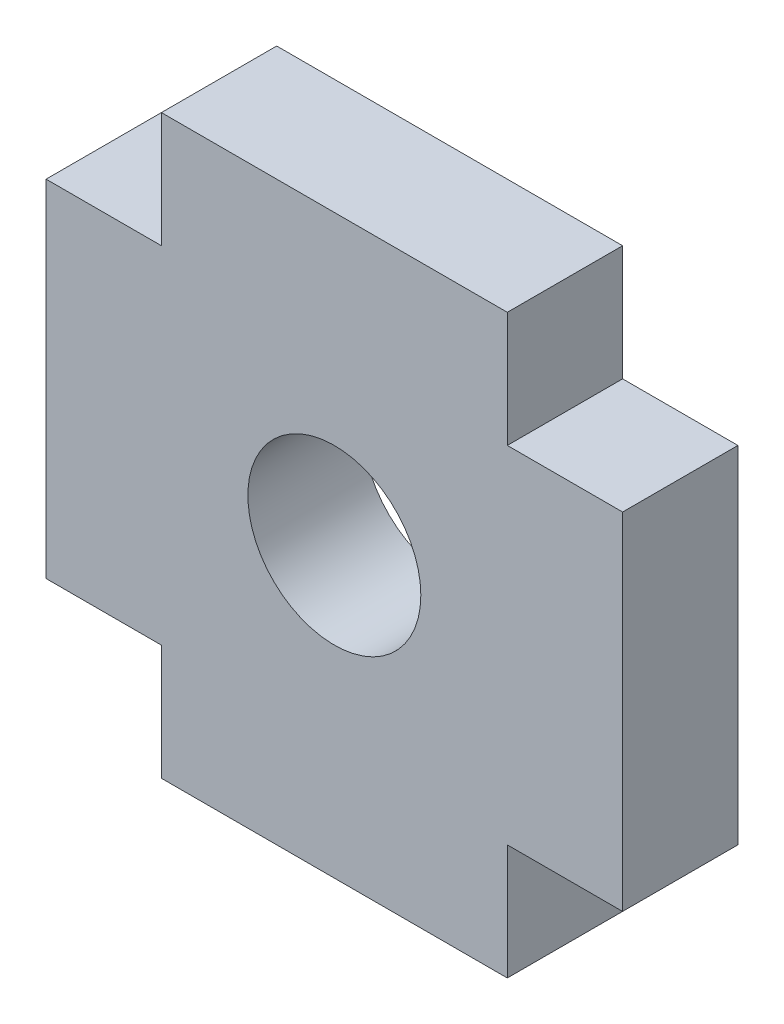
ISO-10303-21;
HEADER;
FILE_DESCRIPTION(('STEP AP214'),'2;1');
FILE_NAME('part.step','',(''),(''),'','','');
FILE_SCHEMA(('AUTOMOTIVE_DESIGN { 1 0 10303 214 1 1 1 1 }'));
ENDSEC;
DATA;
#1=APPLICATION_CONTEXT('core data for automotive mechanical design processes');
#2=APPLICATION_PROTOCOL_DEFINITION('international standard','automotive_design',2000,#1);
#3=PRODUCT_CONTEXT('',#1,'mechanical');
#4=PRODUCT('Part','Part','',(#3));
#5=PRODUCT_RELATED_PRODUCT_CATEGORY('part','',(#4));
#6=PRODUCT_DEFINITION_FORMATION('','',#4);
#7=PRODUCT_DEFINITION_CONTEXT('part definition',#1,'design');
#8=PRODUCT_DEFINITION('design','',#6,#7);
#9=PRODUCT_DEFINITION_SHAPE('','',#8);
#10=(LENGTH_UNIT() NAMED_UNIT(*) SI_UNIT(.MILLI.,.METRE.));
#11=(NAMED_UNIT(*) PLANE_ANGLE_UNIT() SI_UNIT($,.RADIAN.));
#12=(NAMED_UNIT(*) SI_UNIT($,.STERADIAN.) SOLID_ANGLE_UNIT());
#13=UNCERTAINTY_MEASURE_WITH_UNIT(LENGTH_MEASURE(1.E-05),#10,'distance_accuracy_value','');
#14=(GEOMETRIC_REPRESENTATION_CONTEXT(3) GLOBAL_UNCERTAINTY_ASSIGNED_CONTEXT((#13)) GLOBAL_UNIT_ASSIGNED_CONTEXT((#10,
#11,#12)) REPRESENTATION_CONTEXT('',''));
#15=CARTESIAN_POINT('',(0.,0.,0.));
#16=DIRECTION('',(0.,0.,1.));
#17=DIRECTION('',(1.,0.,0.));
#18=AXIS2_PLACEMENT_3D('',#15,#16,#17);
#19=CARTESIAN_POINT('',(0.,0.,2.));
#20=DIRECTION('',(0.,0.,1.));
#21=DIRECTION('',(1.,0.,0.));
#22=AXIS2_PLACEMENT_3D('',#19,#20,#21);
#23=PLANE('',#22);
#24=DIRECTION('',(0.,-1.,0.));
#25=VECTOR('',#24,1.);
#26=CARTESIAN_POINT('',(2078.67595263579,1296.22347890105,2.));
#27=LINE('',#26,#25);
#28=CARTESIAN_POINT('',(2078.67595263579,1296.22347890105,2.));
#29=VERTEX_POINT('',#28);
#30=CARTESIAN_POINT('',(2078.67595263579,1290.22347890105,2.));
#31=VERTEX_POINT('',#30);
#32=EDGE_CURVE('E178',#29,#31,#27,.T.);
#33=ORIENTED_EDGE('',*,*,#32,.T.);
#34=DIRECTION('',(1.,0.,0.));
#35=VECTOR('',#34,1.);
#36=CARTESIAN_POINT('',(2078.67595263579,1290.22347890105,2.));
#37=LINE('',#36,#35);
#38=CARTESIAN_POINT('',(2080.67595263579,1290.22347890105,2.));
#39=VERTEX_POINT('',#38);
#40=EDGE_CURVE('E106',#31,#39,#37,.T.);
#41=ORIENTED_EDGE('',*,*,#40,.T.);
#42=DIRECTION('',(0.,-1.,0.));
#43=VECTOR('',#42,1.);
#44=CARTESIAN_POINT('',(2080.67595263579,1290.22347890105,2.));
#45=LINE('',#44,#43);
#46=CARTESIAN_POINT('',(2080.67595263579,1288.22347890105,2.));
#47=VERTEX_POINT('',#46);
#48=EDGE_CURVE('E205',#39,#47,#45,.T.);
#49=ORIENTED_EDGE('',*,*,#48,.T.);
#50=DIRECTION('',(1.,0.,0.));
#51=VECTOR('',#50,1.);
#52=CARTESIAN_POINT('',(2080.67595263579,1288.22347890105,2.));
#53=LINE('',#52,#51);
#54=CARTESIAN_POINT('',(2086.67595263579,1288.22347890105,2.));
#55=VERTEX_POINT('',#54);
#56=EDGE_CURVE('E224',#47,#55,#53,.T.);
#57=ORIENTED_EDGE('',*,*,#56,.T.);
#58=DIRECTION('',(0.,1.,0.));
#59=VECTOR('',#58,1.);
#60=CARTESIAN_POINT('',(2086.67595263579,1288.22347890105,2.));
#61=LINE('',#60,#59);
#62=CARTESIAN_POINT('',(2086.67595263579,1290.22347890105,2.));
#63=VERTEX_POINT('',#62);
#64=EDGE_CURVE('E221',#55,#63,#61,.T.);
#65=ORIENTED_EDGE('',*,*,#64,.T.);
#66=DIRECTION('',(1.,0.,0.));
#67=VECTOR('',#66,1.);
#68=CARTESIAN_POINT('',(2088.67595263579,1290.22347890105,2.));
#69=LINE('',#68,#67);
#70=CARTESIAN_POINT('',(2088.67595263579,1290.22347890105,2.));
#71=VERTEX_POINT('',#70);
#72=EDGE_CURVE('E223',#63,#71,#69,.T.);
#73=ORIENTED_EDGE('',*,*,#72,.T.);
#74=DIRECTION('',(0.,1.,0.));
#75=VECTOR('',#74,1.);
#76=CARTESIAN_POINT('',(2088.67595263579,1296.22347890105,2.));
#77=LINE('',#76,#75);
#78=CARTESIAN_POINT('',(2088.67595263579,1296.22347890105,2.));
#79=VERTEX_POINT('',#78);
#80=EDGE_CURVE('E226',#71,#79,#77,.T.);
#81=ORIENTED_EDGE('',*,*,#80,.T.);
#82=DIRECTION('',(-1.,0.,0.));
#83=VECTOR('',#82,1.);
#84=CARTESIAN_POINT('',(2086.67595263579,1296.22347890105,2.));
#85=LINE('',#84,#83);
#86=CARTESIAN_POINT('',(2086.67595263579,1296.22347890105,2.));
#87=VERTEX_POINT('',#86);
#88=EDGE_CURVE('E232',#79,#87,#85,.T.);
#89=ORIENTED_EDGE('',*,*,#88,.T.);
#90=DIRECTION('',(0.,1.,0.));
#91=VECTOR('',#90,1.);
#92=CARTESIAN_POINT('',(2086.67595263579,1296.22347890105,2.));
#93=LINE('',#92,#91);
#94=CARTESIAN_POINT('',(2086.67595263579,1298.22347890105,2.));
#95=VERTEX_POINT('',#94);
#96=EDGE_CURVE('E137',#87,#95,#93,.T.);
#97=ORIENTED_EDGE('',*,*,#96,.T.);
#98=DIRECTION('',(-1.,0.,0.));
#99=VECTOR('',#98,1.);
#100=CARTESIAN_POINT('',(2086.67595263579,1298.22347890105,2.));
#101=LINE('',#100,#99);
#102=CARTESIAN_POINT('',(2080.67595263579,1298.22347890105,2.));
#103=VERTEX_POINT('',#102);
#104=EDGE_CURVE('E131',#95,#103,#101,.T.);
#105=ORIENTED_EDGE('',*,*,#104,.T.);
#106=DIRECTION('',(0.,-1.,0.));
#107=VECTOR('',#106,1.);
#108=CARTESIAN_POINT('',(2080.67595263579,1298.22347890105,2.));
#109=LINE('',#108,#107);
#110=CARTESIAN_POINT('',(2080.67595263579,1296.22347890105,2.));
#111=VERTEX_POINT('',#110);
#112=EDGE_CURVE('E135',#103,#111,#109,.T.);
#113=ORIENTED_EDGE('',*,*,#112,.T.);
#114=DIRECTION('',(-1.,0.,0.));
#115=VECTOR('',#114,1.);
#116=CARTESIAN_POINT('',(2080.67595263579,1296.22347890105,2.));
#117=LINE('',#116,#115);
#118=EDGE_CURVE('E51',#111,#29,#117,.T.);
#119=ORIENTED_EDGE('',*,*,#118,.T.);
#120=EDGE_LOOP('',(#33,#41,#49,#57,#65,#73,#81,#89,#97,#105,#113,#119));
#121=FACE_BOUND('',#120,.T.);
#122=CARTESIAN_POINT('',(2083.67595263579,1293.22347890105,2.));
#123=DIRECTION('',(0.,0.,1.));
#124=DIRECTION('',(1.,0.,0.));
#125=AXIS2_PLACEMENT_3D('',#122,#123,#124);
#126=CIRCLE('',#125,1.50000000000006);
#127=CARTESIAN_POINT('',(2085.17595263579,1293.22347890105,2.));
#128=VERTEX_POINT('',#127);
#129=EDGE_CURVE('E159',#128,#128,#126,.T.);
#130=ORIENTED_EDGE('',*,*,#129,.F.);
#131=EDGE_LOOP('',(#130));
#132=FACE_BOUND('',#131,.T.);
#133=ADVANCED_FACE('F34',(#121,#132),#23,.T.);
#134=CARTESIAN_POINT('',(0.,0.,0.));
#135=DIRECTION('',(0.,0.,1.));
#136=DIRECTION('',(1.,0.,0.));
#137=AXIS2_PLACEMENT_3D('',#134,#135,#136);
#138=PLANE('',#137);
#139=DIRECTION('',(0.,-1.,0.));
#140=VECTOR('',#139,1.);
#141=CARTESIAN_POINT('',(2078.67595263579,1296.22347890105,0.));
#142=LINE('',#141,#140);
#143=CARTESIAN_POINT('',(2078.67595263579,1296.22347890105,0.));
#144=VERTEX_POINT('',#143);
#145=CARTESIAN_POINT('',(2078.67595263579,1290.22347890105,0.));
#146=VERTEX_POINT('',#145);
#147=EDGE_CURVE('E155',#144,#146,#142,.T.);
#148=ORIENTED_EDGE('',*,*,#147,.F.);
#149=DIRECTION('',(-1.,0.,0.));
#150=VECTOR('',#149,1.);
#151=CARTESIAN_POINT('',(2080.67595263579,1296.22347890105,0.));
#152=LINE('',#151,#150);
#153=CARTESIAN_POINT('',(2080.67595263579,1296.22347890105,0.));
#154=VERTEX_POINT('',#153);
#155=EDGE_CURVE('E98',#154,#144,#152,.T.);
#156=ORIENTED_EDGE('',*,*,#155,.F.);
#157=DIRECTION('',(0.,-1.,0.));
#158=VECTOR('',#157,1.);
#159=CARTESIAN_POINT('',(2080.67595263579,1298.22347890105,0.));
#160=LINE('',#159,#158);
#161=CARTESIAN_POINT('',(2080.67595263579,1298.22347890105,0.));
#162=VERTEX_POINT('',#161);
#163=EDGE_CURVE('E92',#162,#154,#160,.T.);
#164=ORIENTED_EDGE('',*,*,#163,.F.);
#165=DIRECTION('',(-1.,0.,0.));
#166=VECTOR('',#165,1.);
#167=CARTESIAN_POINT('',(2086.67595263579,1298.22347890105,0.));
#168=LINE('',#167,#166);
#169=CARTESIAN_POINT('',(2086.67595263579,1298.22347890105,0.));
#170=VERTEX_POINT('',#169);
#171=EDGE_CURVE('E145',#170,#162,#168,.T.);
#172=ORIENTED_EDGE('',*,*,#171,.F.);
#173=DIRECTION('',(0.,1.,0.));
#174=VECTOR('',#173,1.);
#175=CARTESIAN_POINT('',(2086.67595263579,1296.22347890105,0.));
#176=LINE('',#175,#174);
#177=CARTESIAN_POINT('',(2086.67595263579,1296.22347890105,0.));
#178=VERTEX_POINT('',#177);
#179=EDGE_CURVE('E173',#178,#170,#176,.T.);
#180=ORIENTED_EDGE('',*,*,#179,.F.);
#181=DIRECTION('',(-1.,0.,0.));
#182=VECTOR('',#181,1.);
#183=CARTESIAN_POINT('',(2086.67595263579,1296.22347890105,0.));
#184=LINE('',#183,#182);
#185=CARTESIAN_POINT('',(2088.67595263579,1296.22347890105,0.));
#186=VERTEX_POINT('',#185);
#187=EDGE_CURVE('E171',#186,#178,#184,.T.);
#188=ORIENTED_EDGE('',*,*,#187,.F.);
#189=DIRECTION('',(0.,1.,0.));
#190=VECTOR('',#189,1.);
#191=CARTESIAN_POINT('',(2088.67595263579,1296.22347890105,0.));
#192=LINE('',#191,#190);
#193=CARTESIAN_POINT('',(2088.67595263579,1290.22347890105,0.));
#194=VERTEX_POINT('',#193);
#195=EDGE_CURVE('E169',#194,#186,#192,.T.);
#196=ORIENTED_EDGE('',*,*,#195,.F.);
#197=DIRECTION('',(1.,0.,0.));
#198=VECTOR('',#197,1.);
#199=CARTESIAN_POINT('',(2088.67595263579,1290.22347890105,0.));
#200=LINE('',#199,#198);
#201=CARTESIAN_POINT('',(2086.67595263579,1290.22347890105,0.));
#202=VERTEX_POINT('',#201);
#203=EDGE_CURVE('E167',#202,#194,#200,.T.);
#204=ORIENTED_EDGE('',*,*,#203,.F.);
#205=DIRECTION('',(0.,1.,0.));
#206=VECTOR('',#205,1.);
#207=CARTESIAN_POINT('',(2086.67595263579,1288.22347890105,0.));
#208=LINE('',#207,#206);
#209=CARTESIAN_POINT('',(2086.67595263579,1288.22347890105,0.));
#210=VERTEX_POINT('',#209);
#211=EDGE_CURVE('E165',#210,#202,#208,.T.);
#212=ORIENTED_EDGE('',*,*,#211,.F.);
#213=DIRECTION('',(1.,0.,0.));
#214=VECTOR('',#213,1.);
#215=CARTESIAN_POINT('',(2080.67595263579,1288.22347890105,0.));
#216=LINE('',#215,#214);
#217=CARTESIAN_POINT('',(2080.67595263579,1288.22347890105,0.));
#218=VERTEX_POINT('',#217);
#219=EDGE_CURVE('E163',#218,#210,#216,.T.);
#220=ORIENTED_EDGE('',*,*,#219,.F.);
#221=DIRECTION('',(0.,-1.,0.));
#222=VECTOR('',#221,1.);
#223=CARTESIAN_POINT('',(2080.67595263579,1290.22347890105,0.));
#224=LINE('',#223,#222);
#225=CARTESIAN_POINT('',(2080.67595263579,1290.22347890105,0.));
#226=VERTEX_POINT('',#225);
#227=EDGE_CURVE('E161',#226,#218,#224,.T.);
#228=ORIENTED_EDGE('',*,*,#227,.F.);
#229=DIRECTION('',(1.,0.,0.));
#230=VECTOR('',#229,1.);
#231=CARTESIAN_POINT('',(2078.67595263579,1290.22347890105,0.));
#232=LINE('',#231,#230);
#233=EDGE_CURVE('E158',#146,#226,#232,.T.);
#234=ORIENTED_EDGE('',*,*,#233,.F.);
#235=EDGE_LOOP('',(#148,#156,#164,#172,#180,#188,#196,#204,#212,#220,#228,#234));
#236=FACE_BOUND('',#235,.T.);
#237=CARTESIAN_POINT('',(2083.67595263579,1293.22347890105,0.));
#238=DIRECTION('',(0.,0.,1.));
#239=DIRECTION('',(1.,0.,0.));
#240=AXIS2_PLACEMENT_3D('',#237,#238,#239);
#241=CIRCLE('',#240,1.50000000000006);
#242=CARTESIAN_POINT('',(2085.17595263579,1293.22347890105,0.));
#243=VERTEX_POINT('',#242);
#244=EDGE_CURVE('E394',#243,#243,#241,.T.);
#245=ORIENTED_EDGE('',*,*,#244,.T.);
#246=EDGE_LOOP('',(#245));
#247=FACE_BOUND('',#246,.T.);
#248=ADVANCED_FACE('F209',(#236,#247),#138,.F.);
#249=CARTESIAN_POINT('',(2078.67595263579,1296.22347890105,2.));
#250=DIRECTION('',(1.,0.,0.));
#251=DIRECTION('',(0.,0.,-1.));
#252=AXIS2_PLACEMENT_3D('',#249,#250,#251);
#253=PLANE('',#252);
#254=ORIENTED_EDGE('',*,*,#147,.T.);
#255=DIRECTION('',(0.,0.,-1.));
#256=VECTOR('',#255,1.);
#257=CARTESIAN_POINT('',(2078.67595263579,1290.22347890105,2.));
#258=LINE('',#257,#256);
#259=EDGE_CURVE('E11',#31,#146,#258,.T.);
#260=ORIENTED_EDGE('',*,*,#259,.F.);
#261=ORIENTED_EDGE('',*,*,#32,.F.);
#262=DIRECTION('',(0.,0.,-1.));
#263=VECTOR('',#262,1.);
#264=CARTESIAN_POINT('',(2078.67595263579,1296.22347890105,2.));
#265=LINE('',#264,#263);
#266=EDGE_CURVE('E151',#29,#144,#265,.T.);
#267=ORIENTED_EDGE('',*,*,#266,.T.);
#268=EDGE_LOOP('',(#254,#260,#261,#267));
#269=FACE_BOUND('',#268,.T.);
#270=ADVANCED_FACE('F36',(#269),#253,.F.);
#271=CARTESIAN_POINT('',(2078.67595263579,1290.22347890105,2.));
#272=DIRECTION('',(0.,1.,0.));
#273=DIRECTION('',(0.,0.,1.));
#274=AXIS2_PLACEMENT_3D('',#271,#272,#273);
#275=PLANE('',#274);
#276=ORIENTED_EDGE('',*,*,#233,.T.);
#277=DIRECTION('',(0.,0.,-1.));
#278=VECTOR('',#277,1.);
#279=CARTESIAN_POINT('',(2080.67595263579,1290.22347890105,2.));
#280=LINE('',#279,#278);
#281=EDGE_CURVE('E43',#39,#226,#280,.T.);
#282=ORIENTED_EDGE('',*,*,#281,.F.);
#283=ORIENTED_EDGE('',*,*,#40,.F.);
#284=ORIENTED_EDGE('',*,*,#259,.T.);
#285=EDGE_LOOP('',(#276,#282,#283,#284));
#286=FACE_BOUND('',#285,.T.);
#287=ADVANCED_FACE('F266',(#286),#275,.F.);
#288=CARTESIAN_POINT('',(2080.67595263579,1290.22347890105,2.));
#289=DIRECTION('',(1.,0.,0.));
#290=DIRECTION('',(0.,0.,-1.));
#291=AXIS2_PLACEMENT_3D('',#288,#289,#290);
#292=PLANE('',#291);
#293=ORIENTED_EDGE('',*,*,#227,.T.);
#294=DIRECTION('',(0.,0.,-1.));
#295=VECTOR('',#294,1.);
#296=CARTESIAN_POINT('',(2080.67595263579,1288.22347890105,2.));
#297=LINE('',#296,#295);
#298=EDGE_CURVE('E197',#47,#218,#297,.T.);
#299=ORIENTED_EDGE('',*,*,#298,.F.);
#300=ORIENTED_EDGE('',*,*,#48,.F.);
#301=ORIENTED_EDGE('',*,*,#281,.T.);
#302=EDGE_LOOP('',(#293,#299,#300,#301));
#303=FACE_BOUND('',#302,.T.);
#304=ADVANCED_FACE('F203',(#303),#292,.F.);
#305=CARTESIAN_POINT('',(2080.67595263579,1288.22347890105,2.));
#306=DIRECTION('',(0.,1.,0.));
#307=DIRECTION('',(0.,0.,1.));
#308=AXIS2_PLACEMENT_3D('',#305,#306,#307);
#309=PLANE('',#308);
#310=ORIENTED_EDGE('',*,*,#219,.T.);
#311=DIRECTION('',(0.,0.,-1.));
#312=VECTOR('',#311,1.);
#313=CARTESIAN_POINT('',(2086.67595263579,1288.22347890105,2.));
#314=LINE('',#313,#312);
#315=EDGE_CURVE('E194',#55,#210,#314,.T.);
#316=ORIENTED_EDGE('',*,*,#315,.F.);
#317=ORIENTED_EDGE('',*,*,#56,.F.);
#318=ORIENTED_EDGE('',*,*,#298,.T.);
#319=EDGE_LOOP('',(#310,#316,#317,#318));
#320=FACE_BOUND('',#319,.T.);
#321=ADVANCED_FACE('F215',(#320),#309,.F.);
#322=CARTESIAN_POINT('',(2086.67595263579,1288.22347890105,2.));
#323=DIRECTION('',(-1.,0.,0.));
#324=DIRECTION('',(0.,0.,1.));
#325=AXIS2_PLACEMENT_3D('',#322,#323,#324);
#326=PLANE('',#325);
#327=ORIENTED_EDGE('',*,*,#211,.T.);
#328=DIRECTION('',(0.,0.,-1.));
#329=VECTOR('',#328,1.);
#330=CARTESIAN_POINT('',(2086.67595263579,1290.22347890105,2.));
#331=LINE('',#330,#329);
#332=EDGE_CURVE('E191',#63,#202,#331,.T.);
#333=ORIENTED_EDGE('',*,*,#332,.F.);
#334=ORIENTED_EDGE('',*,*,#64,.F.);
#335=ORIENTED_EDGE('',*,*,#315,.T.);
#336=EDGE_LOOP('',(#327,#333,#334,#335));
#337=FACE_BOUND('',#336,.T.);
#338=ADVANCED_FACE('F219',(#337),#326,.F.);
#339=CARTESIAN_POINT('',(2088.67595263579,1290.22347890105,2.));
#340=DIRECTION('',(0.,1.,0.));
#341=DIRECTION('',(0.,0.,1.));
#342=AXIS2_PLACEMENT_3D('',#339,#340,#341);
#343=PLANE('',#342);
#344=ORIENTED_EDGE('',*,*,#203,.T.);
#345=DIRECTION('',(0.,0.,-1.));
#346=VECTOR('',#345,1.);
#347=CARTESIAN_POINT('',(2088.67595263579,1290.22347890105,2.));
#348=LINE('',#347,#346);
#349=EDGE_CURVE('E188',#71,#194,#348,.T.);
#350=ORIENTED_EDGE('',*,*,#349,.F.);
#351=ORIENTED_EDGE('',*,*,#72,.F.);
#352=ORIENTED_EDGE('',*,*,#332,.T.);
#353=EDGE_LOOP('',(#344,#350,#351,#352));
#354=FACE_BOUND('',#353,.T.);
#355=ADVANCED_FACE('F279',(#354),#343,.F.);
#356=CARTESIAN_POINT('',(2088.67595263579,1296.22347890105,2.));
#357=DIRECTION('',(-1.,0.,0.));
#358=DIRECTION('',(0.,-1.,0.));
#359=AXIS2_PLACEMENT_3D('',#356,#357,#358);
#360=PLANE('',#359);
#361=ORIENTED_EDGE('',*,*,#195,.T.);
#362=DIRECTION('',(0.,0.,-1.));
#363=VECTOR('',#362,1.);
#364=CARTESIAN_POINT('',(2088.67595263579,1296.22347890105,2.));
#365=LINE('',#364,#363);
#366=EDGE_CURVE('E185',#79,#186,#365,.T.);
#367=ORIENTED_EDGE('',*,*,#366,.F.);
#368=ORIENTED_EDGE('',*,*,#80,.F.);
#369=ORIENTED_EDGE('',*,*,#349,.T.);
#370=EDGE_LOOP('',(#361,#367,#368,#369));
#371=FACE_BOUND('',#370,.T.);
#372=ADVANCED_FACE('F282',(#371),#360,.F.);
#373=CARTESIAN_POINT('',(2086.67595263579,1296.22347890105,2.));
#374=DIRECTION('',(0.,-1.,0.));
#375=DIRECTION('',(0.,0.,-1.));
#376=AXIS2_PLACEMENT_3D('',#373,#374,#375);
#377=PLANE('',#376);
#378=ORIENTED_EDGE('',*,*,#187,.T.);
#379=DIRECTION('',(0.,0.,-1.));
#380=VECTOR('',#379,1.);
#381=CARTESIAN_POINT('',(2086.67595263579,1296.22347890105,2.));
#382=LINE('',#381,#380);
#383=EDGE_CURVE('E182',#87,#178,#382,.T.);
#384=ORIENTED_EDGE('',*,*,#383,.F.);
#385=ORIENTED_EDGE('',*,*,#88,.F.);
#386=ORIENTED_EDGE('',*,*,#366,.T.);
#387=EDGE_LOOP('',(#378,#384,#385,#386));
#388=FACE_BOUND('',#387,.T.);
#389=ADVANCED_FACE('F238',(#388),#377,.F.);
#390=CARTESIAN_POINT('',(2086.67595263579,1296.22347890105,2.));
#391=DIRECTION('',(-1.,0.,0.));
#392=DIRECTION('',(0.,0.,1.));
#393=AXIS2_PLACEMENT_3D('',#390,#391,#392);
#394=PLANE('',#393);
#395=ORIENTED_EDGE('',*,*,#179,.T.);
#396=DIRECTION('',(0.,0.,-1.));
#397=VECTOR('',#396,1.);
#398=CARTESIAN_POINT('',(2086.67595263579,1298.22347890105,2.));
#399=LINE('',#398,#397);
#400=EDGE_CURVE('E146',#95,#170,#399,.T.);
#401=ORIENTED_EDGE('',*,*,#400,.F.);
#402=ORIENTED_EDGE('',*,*,#96,.F.);
#403=ORIENTED_EDGE('',*,*,#383,.T.);
#404=EDGE_LOOP('',(#395,#401,#402,#403));
#405=FACE_BOUND('',#404,.T.);
#406=ADVANCED_FACE('F242',(#405),#394,.F.);
#407=CARTESIAN_POINT('',(2086.67595263579,1298.22347890105,2.));
#408=DIRECTION('',(0.,-1.,0.));
#409=DIRECTION('',(0.,0.,-1.));
#410=AXIS2_PLACEMENT_3D('',#407,#408,#409);
#411=PLANE('',#410);
#412=ORIENTED_EDGE('',*,*,#171,.T.);
#413=DIRECTION('',(0.,0.,-1.));
#414=VECTOR('',#413,1.);
#415=CARTESIAN_POINT('',(2080.67595263579,1298.22347890105,2.));
#416=LINE('',#415,#414);
#417=EDGE_CURVE('E142',#103,#162,#416,.T.);
#418=ORIENTED_EDGE('',*,*,#417,.F.);
#419=ORIENTED_EDGE('',*,*,#104,.F.);
#420=ORIENTED_EDGE('',*,*,#400,.T.);
#421=EDGE_LOOP('',(#412,#418,#419,#420));
#422=FACE_BOUND('',#421,.T.);
#423=ADVANCED_FACE('F143',(#422),#411,.F.);
#424=CARTESIAN_POINT('',(2080.67595263579,1298.22347890105,2.));
#425=DIRECTION('',(1.,0.,0.));
#426=DIRECTION('',(0.,0.,-1.));
#427=AXIS2_PLACEMENT_3D('',#424,#425,#426);
#428=PLANE('',#427);
#429=ORIENTED_EDGE('',*,*,#163,.T.);
#430=DIRECTION('',(0.,0.,-1.));
#431=VECTOR('',#430,1.);
#432=CARTESIAN_POINT('',(2080.67595263579,1296.22347890105,2.));
#433=LINE('',#432,#431);
#434=EDGE_CURVE('E147',#111,#154,#433,.T.);
#435=ORIENTED_EDGE('',*,*,#434,.F.);
#436=ORIENTED_EDGE('',*,*,#112,.F.);
#437=ORIENTED_EDGE('',*,*,#417,.T.);
#438=EDGE_LOOP('',(#429,#435,#436,#437));
#439=FACE_BOUND('',#438,.T.);
#440=ADVANCED_FACE('F149',(#439),#428,.F.);
#441=CARTESIAN_POINT('',(2080.67595263579,1296.22347890105,2.));
#442=DIRECTION('',(0.,-1.,0.));
#443=DIRECTION('',(0.,0.,-1.));
#444=AXIS2_PLACEMENT_3D('',#441,#442,#443);
#445=PLANE('',#444);
#446=ORIENTED_EDGE('',*,*,#155,.T.);
#447=ORIENTED_EDGE('',*,*,#266,.F.);
#448=ORIENTED_EDGE('',*,*,#118,.F.);
#449=ORIENTED_EDGE('',*,*,#434,.T.);
#450=EDGE_LOOP('',(#446,#447,#448,#449));
#451=FACE_BOUND('',#450,.T.);
#452=ADVANCED_FACE('F246',(#451),#445,.F.);
#453=CARTESIAN_POINT('',(2083.67595263579,1293.22347890105,2.));
#454=DIRECTION('',(0.,0.,-1.));
#455=DIRECTION('',(-1.,0.,0.));
#456=AXIS2_PLACEMENT_3D('',#453,#454,#455);
#457=CYLINDRICAL_SURFACE('',#456,1.50000000000006);
#458=ORIENTED_EDGE('',*,*,#129,.T.);
#459=EDGE_LOOP('',(#458));
#460=FACE_BOUND('',#459,.T.);
#461=ORIENTED_EDGE('',*,*,#244,.F.);
#462=EDGE_LOOP('',(#461));
#463=FACE_BOUND('',#462,.T.);
#464=ADVANCED_FACE('F248',(#460,#463),#457,.F.);
#465=CLOSED_SHELL('',(#133,#248,#270,#287,#304,#321,#338,#355,#372,#389,#406,#423,#440,#452,#464));
#466=MANIFOLD_SOLID_BREP('B2',#465);
#467=ADVANCED_BREP_SHAPE_REPRESENTATION('',(#18,#466),#14);
#468=SHAPE_DEFINITION_REPRESENTATION(#9,#467);
ENDSEC;
END-ISO-10303-21;
